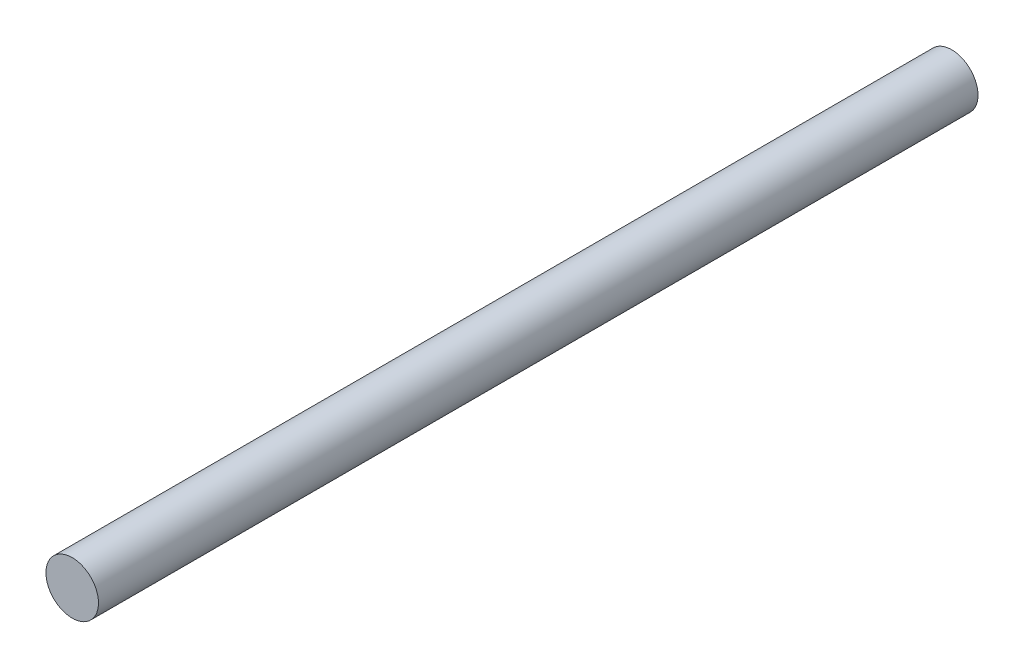
ISO-10303-21;
HEADER;
FILE_DESCRIPTION(('STEP AP214'),'2;1');
FILE_NAME('part.step','',(''),(''),'','','');
FILE_SCHEMA(('AUTOMOTIVE_DESIGN { 1 0 10303 214 1 1 1 1 }'));
ENDSEC;
DATA;
#1=APPLICATION_CONTEXT('core data for automotive mechanical design processes');
#2=APPLICATION_PROTOCOL_DEFINITION('international standard','automotive_design',2000,#1);
#3=PRODUCT_CONTEXT('',#1,'mechanical');
#4=PRODUCT('Part','Part','',(#3));
#5=PRODUCT_RELATED_PRODUCT_CATEGORY('part','',(#4));
#6=PRODUCT_DEFINITION_FORMATION('','',#4);
#7=PRODUCT_DEFINITION_CONTEXT('part definition',#1,'design');
#8=PRODUCT_DEFINITION('design','',#6,#7);
#9=PRODUCT_DEFINITION_SHAPE('','',#8);
#10=(LENGTH_UNIT() NAMED_UNIT(*) SI_UNIT(.MILLI.,.METRE.));
#11=(NAMED_UNIT(*) PLANE_ANGLE_UNIT() SI_UNIT($,.RADIAN.));
#12=(NAMED_UNIT(*) SI_UNIT($,.STERADIAN.) SOLID_ANGLE_UNIT());
#13=UNCERTAINTY_MEASURE_WITH_UNIT(LENGTH_MEASURE(1.E-05),#10,'distance_accuracy_value','');
#14=(GEOMETRIC_REPRESENTATION_CONTEXT(3) GLOBAL_UNCERTAINTY_ASSIGNED_CONTEXT((#13)) GLOBAL_UNIT_ASSIGNED_CONTEXT((#10,
#11,#12)) REPRESENTATION_CONTEXT('',''));
#15=CARTESIAN_POINT('',(0.,0.,0.));
#16=DIRECTION('',(0.,0.,1.));
#17=DIRECTION('',(1.,0.,0.));
#18=AXIS2_PLACEMENT_3D('',#15,#16,#17);
#19=CARTESIAN_POINT('',(0.,0.,134.));
#20=DIRECTION('',(0.,0.,-1.));
#21=DIRECTION('',(-1.,0.,0.));
#22=AXIS2_PLACEMENT_3D('',#19,#20,#21);
#23=CYLINDRICAL_SURFACE('',#22,4.);
#24=CARTESIAN_POINT('',(0.,0.,134.));
#25=DIRECTION('',(0.,0.,1.));
#26=DIRECTION('',(1.,0.,0.));
#27=AXIS2_PLACEMENT_3D('',#24,#25,#26);
#28=CIRCLE('',#27,4.);
#29=CARTESIAN_POINT('',(4.,0.,134.));
#30=VERTEX_POINT('',#29);
#31=EDGE_CURVE('E10',#30,#30,#28,.T.);
#32=ORIENTED_EDGE('',*,*,#31,.F.);
#33=EDGE_LOOP('',(#32));
#34=FACE_BOUND('',#33,.T.);
#35=CARTESIAN_POINT('',(0.,0.,0.));
#36=DIRECTION('',(0.,0.,1.));
#37=DIRECTION('',(1.,0.,0.));
#38=AXIS2_PLACEMENT_3D('',#35,#36,#37);
#39=CIRCLE('',#38,4.);
#40=CARTESIAN_POINT('',(4.,0.,0.));
#41=VERTEX_POINT('',#40);
#42=EDGE_CURVE('E34',#41,#41,#39,.T.);
#43=ORIENTED_EDGE('',*,*,#42,.T.);
#44=EDGE_LOOP('',(#43));
#45=FACE_BOUND('',#44,.T.);
#46=ADVANCED_FACE('F31',(#34,#45),#23,.T.);
#47=CARTESIAN_POINT('',(0.,0.,134.));
#48=DIRECTION('',(0.,0.,1.));
#49=DIRECTION('',(1.,0.,0.));
#50=AXIS2_PLACEMENT_3D('',#47,#48,#49);
#51=PLANE('',#50);
#52=ORIENTED_EDGE('',*,*,#31,.T.);
#53=EDGE_LOOP('',(#52));
#54=FACE_BOUND('',#53,.T.);
#55=ADVANCED_FACE('F46',(#54),#51,.T.);
#56=CARTESIAN_POINT('',(0.,0.,0.));
#57=DIRECTION('',(0.,0.,1.));
#58=DIRECTION('',(1.,0.,0.));
#59=AXIS2_PLACEMENT_3D('',#56,#57,#58);
#60=PLANE('',#59);
#61=ORIENTED_EDGE('',*,*,#42,.F.);
#62=EDGE_LOOP('',(#61));
#63=FACE_BOUND('',#62,.T.);
#64=ADVANCED_FACE('F44',(#63),#60,.F.);
#65=CLOSED_SHELL('',(#46,#55,#64));
#66=MANIFOLD_SOLID_BREP('B2',#65);
#67=ADVANCED_BREP_SHAPE_REPRESENTATION('',(#18,#66),#14);
#68=SHAPE_DEFINITION_REPRESENTATION(#9,#67);
ENDSEC;
END-ISO-10303-21;
